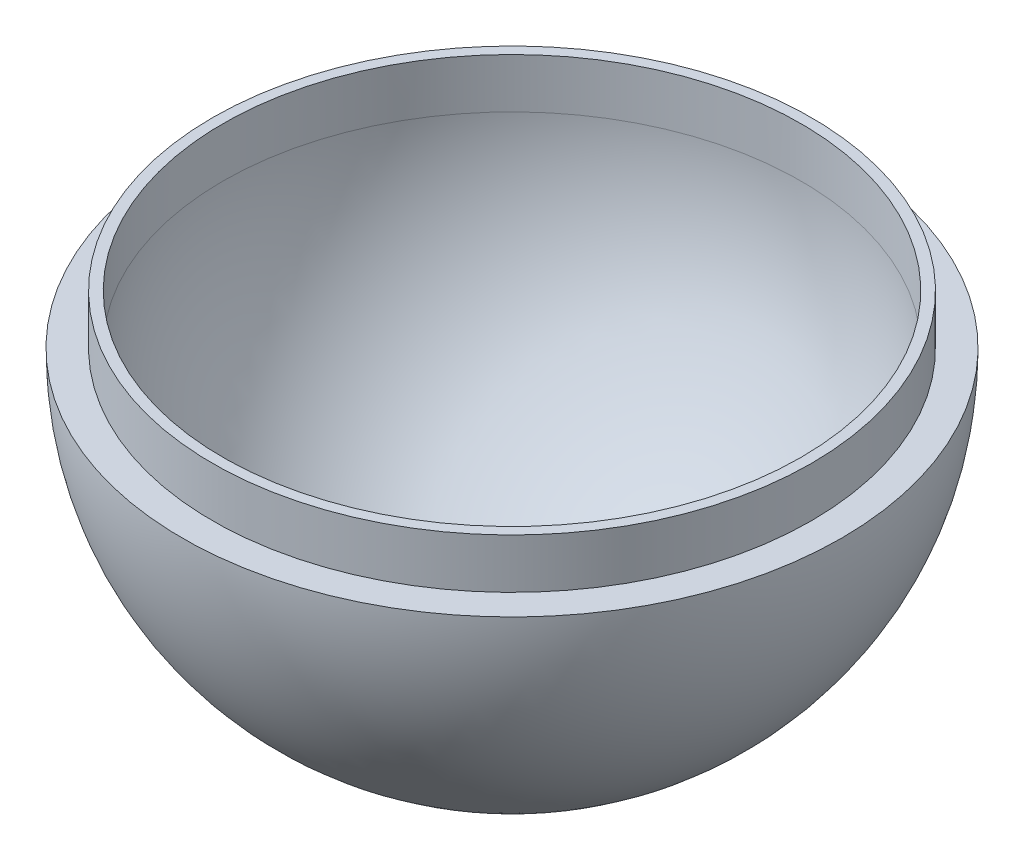
ISO-10303-21;
HEADER;
FILE_DESCRIPTION(('STEP AP214'),'2;1');
FILE_NAME('part.step','',(''),(''),'','','');
FILE_SCHEMA(('AUTOMOTIVE_DESIGN { 1 0 10303 214 1 1 1 1 }'));
ENDSEC;
DATA;
#1=APPLICATION_CONTEXT('core data for automotive mechanical design processes');
#2=APPLICATION_PROTOCOL_DEFINITION('international standard','automotive_design',2000,#1);
#3=PRODUCT_CONTEXT('',#1,'mechanical');
#4=PRODUCT('Part','Part','',(#3));
#5=PRODUCT_RELATED_PRODUCT_CATEGORY('part','',(#4));
#6=PRODUCT_DEFINITION_FORMATION('','',#4);
#7=PRODUCT_DEFINITION_CONTEXT('part definition',#1,'design');
#8=PRODUCT_DEFINITION('design','',#6,#7);
#9=PRODUCT_DEFINITION_SHAPE('','',#8);
#10=(LENGTH_UNIT() NAMED_UNIT(*) SI_UNIT(.MILLI.,.METRE.));
#11=(NAMED_UNIT(*) PLANE_ANGLE_UNIT() SI_UNIT($,.RADIAN.));
#12=(NAMED_UNIT(*) SI_UNIT($,.STERADIAN.) SOLID_ANGLE_UNIT());
#13=UNCERTAINTY_MEASURE_WITH_UNIT(LENGTH_MEASURE(1.E-05),#10,'distance_accuracy_value','');
#14=(GEOMETRIC_REPRESENTATION_CONTEXT(3) GLOBAL_UNCERTAINTY_ASSIGNED_CONTEXT((#13)) GLOBAL_UNIT_ASSIGNED_CONTEXT((#10,
#11,#12)) REPRESENTATION_CONTEXT('',''));
#15=CARTESIAN_POINT('',(0.,0.,0.));
#16=DIRECTION('',(0.,0.,1.));
#17=DIRECTION('',(1.,0.,0.));
#18=AXIS2_PLACEMENT_3D('',#15,#16,#17);
#19=CARTESIAN_POINT('',(0.,-29.2467564765256,0.));
#20=DIRECTION('',(0.,-1.,0.));
#21=DIRECTION('',(1.,0.,0.));
#22=AXIS2_PLACEMENT_3D('',#19,#20,#21);
#23=CYLINDRICAL_SURFACE('',#22,25.);
#24=CARTESIAN_POINT('',(0.,4.29999999999999,0.));
#25=DIRECTION('',(0.,-1.,0.));
#26=DIRECTION('',(1.,0.,0.));
#27=AXIS2_PLACEMENT_3D('',#24,#25,#26);
#28=CIRCLE('',#27,25.);
#29=CARTESIAN_POINT('',(25.,4.29999999999999,0.));
#30=VERTEX_POINT('',#29);
#31=EDGE_CURVE('E37',#30,#30,#28,.T.);
#32=ORIENTED_EDGE('',*,*,#31,.F.);
#33=EDGE_LOOP('',(#32));
#34=FACE_BOUND('',#33,.T.);
#35=CARTESIAN_POINT('',(0.,0.,0.));
#36=DIRECTION('',(0.,-1.,0.));
#37=DIRECTION('',(1.,0.,0.));
#38=AXIS2_PLACEMENT_3D('',#35,#36,#37);
#39=CIRCLE('',#38,25.);
#40=CARTESIAN_POINT('',(25.,0.,0.));
#41=VERTEX_POINT('',#40);
#42=EDGE_CURVE('E10',#41,#41,#39,.T.);
#43=ORIENTED_EDGE('',*,*,#42,.T.);
#44=EDGE_LOOP('',(#43));
#45=FACE_BOUND('',#44,.T.);
#46=ADVANCED_FACE('F31',(#34,#45),#23,.F.);
#47=CARTESIAN_POINT('',(-25.9,4.3,0.));
#48=DIRECTION('',(0.,-1.,0.));
#49=DIRECTION('',(1.,0.,0.));
#50=AXIS2_PLACEMENT_3D('',#47,#48,#49);
#51=PLANE('',#50);
#52=CARTESIAN_POINT('',(0.,4.29999999999999,0.));
#53=DIRECTION('',(0.,-1.,0.));
#54=DIRECTION('',(1.,0.,0.));
#55=AXIS2_PLACEMENT_3D('',#52,#53,#54);
#56=CIRCLE('',#55,25.9);
#57=CARTESIAN_POINT('',(25.9,4.29999999999999,0.));
#58=VERTEX_POINT('',#57);
#59=EDGE_CURVE('E41',#58,#58,#56,.T.);
#60=ORIENTED_EDGE('',*,*,#59,.F.);
#61=EDGE_LOOP('',(#60));
#62=FACE_BOUND('',#61,.T.);
#63=ORIENTED_EDGE('',*,*,#31,.T.);
#64=EDGE_LOOP('',(#63));
#65=FACE_BOUND('',#64,.T.);
#66=ADVANCED_FACE('F65',(#62,#65),#51,.F.);
#67=CARTESIAN_POINT('',(0.,-29.2467564765256,0.));
#68=DIRECTION('',(0.,-1.,0.));
#69=DIRECTION('',(1.,0.,0.));
#70=AXIS2_PLACEMENT_3D('',#67,#68,#69);
#71=CYLINDRICAL_SURFACE('',#70,25.9);
#72=CARTESIAN_POINT('',(0.,0.,0.));
#73=DIRECTION('',(0.,-1.,0.));
#74=DIRECTION('',(1.,0.,0.));
#75=AXIS2_PLACEMENT_3D('',#72,#73,#74);
#76=CIRCLE('',#75,25.9);
#77=CARTESIAN_POINT('',(25.9,0.,0.));
#78=VERTEX_POINT('',#77);
#79=EDGE_CURVE('E45',#78,#78,#76,.T.);
#80=ORIENTED_EDGE('',*,*,#79,.F.);
#81=EDGE_LOOP('',(#80));
#82=FACE_BOUND('',#81,.T.);
#83=ORIENTED_EDGE('',*,*,#59,.T.);
#84=EDGE_LOOP('',(#83));
#85=FACE_BOUND('',#84,.T.);
#86=ADVANCED_FACE('F59',(#82,#85),#71,.T.);
#87=CARTESIAN_POINT('',(-28.5034186648068,0.,0.));
#88=DIRECTION('',(0.,-1.,0.));
#89=DIRECTION('',(1.,0.,0.));
#90=AXIS2_PLACEMENT_3D('',#87,#88,#89);
#91=PLANE('',#90);
#92=CARTESIAN_POINT('',(0.,0.,0.));
#93=DIRECTION('',(0.,-1.,0.));
#94=DIRECTION('',(1.,0.,0.));
#95=AXIS2_PLACEMENT_3D('',#92,#93,#94);
#96=CIRCLE('',#95,28.5034186648068);
#97=CARTESIAN_POINT('',(28.5034186648068,0.,0.));
#98=VERTEX_POINT('',#97);
#99=EDGE_CURVE('E50',#98,#98,#96,.T.);
#100=ORIENTED_EDGE('',*,*,#99,.F.);
#101=EDGE_LOOP('',(#100));
#102=FACE_BOUND('',#101,.T.);
#103=ORIENTED_EDGE('',*,*,#79,.T.);
#104=EDGE_LOOP('',(#103));
#105=FACE_BOUND('',#104,.T.);
#106=ADVANCED_FACE('F56',(#102,#105),#91,.F.);
#107=CARTESIAN_POINT('',(0.,0.,0.));
#108=DIRECTION('',(0.,-1.,0.));
#109=DIRECTION('',(-1.,0.,0.));
#110=AXIS2_PLACEMENT_3D('',#107,#108,#109);
#111=SPHERICAL_SURFACE('',#110,28.5034186648068);
#112=ORIENTED_EDGE('',*,*,#99,.T.);
#113=EDGE_LOOP('',(#112));
#114=FACE_BOUND('',#113,.T.);
#115=ADVANCED_FACE('F54',(#114),#111,.T.);
#116=CARTESIAN_POINT('',(0.,0.,0.));
#117=DIRECTION('',(0.,-1.,0.));
#118=DIRECTION('',(-1.,0.,0.));
#119=AXIS2_PLACEMENT_3D('',#116,#117,#118);
#120=SPHERICAL_SURFACE('',#119,25.);
#121=ORIENTED_EDGE('',*,*,#42,.F.);
#122=EDGE_LOOP('',(#121));
#123=FACE_BOUND('',#122,.T.);
#124=ADVANCED_FACE('F77',(#123),#120,.F.);
#125=CLOSED_SHELL('',(#46,#66,#86,#106,#115,#124));
#126=MANIFOLD_SOLID_BREP('B2',#125);
#127=ADVANCED_BREP_SHAPE_REPRESENTATION('',(#18,#126),#14);
#128=SHAPE_DEFINITION_REPRESENTATION(#9,#127);
ENDSEC;
END-ISO-10303-21;
